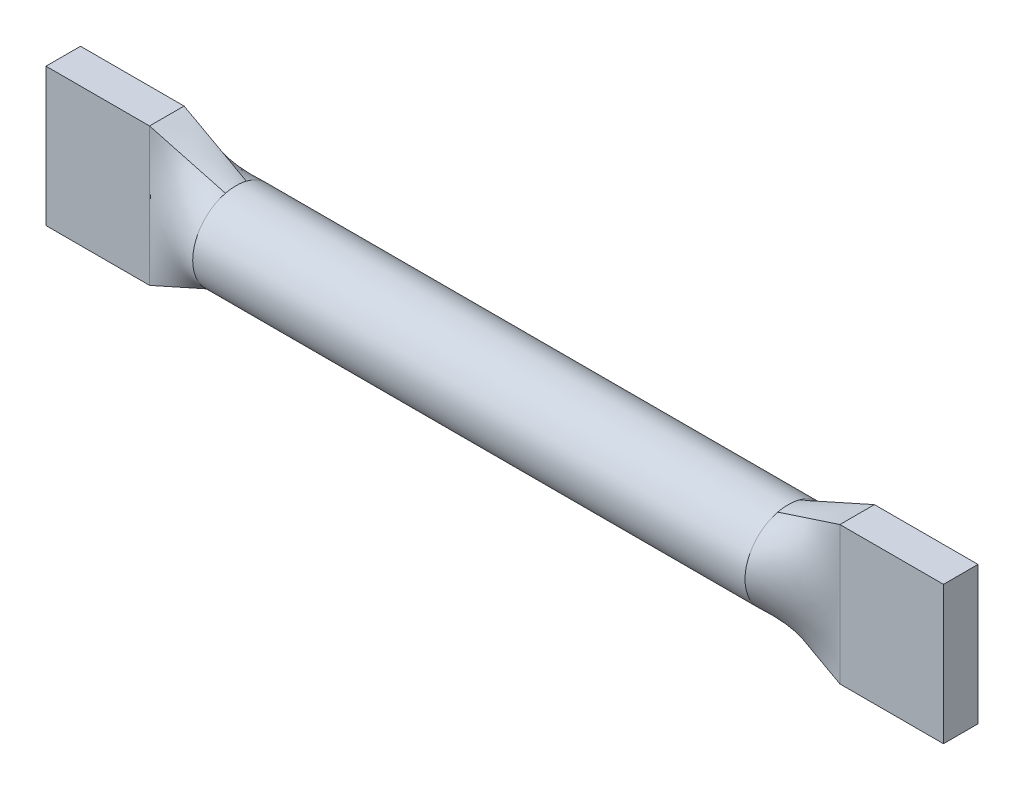
ISO-10303-21;
HEADER;
FILE_DESCRIPTION(('STEP AP214'),'2;1');
FILE_NAME('part.step','',(''),(''),'','','');
FILE_SCHEMA(('AUTOMOTIVE_DESIGN { 1 0 10303 214 1 1 1 1 }'));
ENDSEC;
DATA;
#1=APPLICATION_CONTEXT('core data for automotive mechanical design processes');
#2=APPLICATION_PROTOCOL_DEFINITION('international standard','automotive_design',2000,#1);
#3=PRODUCT_CONTEXT('',#1,'mechanical');
#4=PRODUCT('Part','Part','',(#3));
#5=PRODUCT_RELATED_PRODUCT_CATEGORY('part','',(#4));
#6=PRODUCT_DEFINITION_FORMATION('','',#4);
#7=PRODUCT_DEFINITION_CONTEXT('part definition',#1,'design');
#8=PRODUCT_DEFINITION('design','',#6,#7);
#9=PRODUCT_DEFINITION_SHAPE('','',#8);
#10=(LENGTH_UNIT() NAMED_UNIT(*) SI_UNIT(.MILLI.,.METRE.));
#11=(NAMED_UNIT(*) PLANE_ANGLE_UNIT() SI_UNIT($,.RADIAN.));
#12=(NAMED_UNIT(*) SI_UNIT($,.STERADIAN.) SOLID_ANGLE_UNIT());
#13=UNCERTAINTY_MEASURE_WITH_UNIT(LENGTH_MEASURE(1.E-05),#10,'distance_accuracy_value','');
#14=(GEOMETRIC_REPRESENTATION_CONTEXT(3) GLOBAL_UNCERTAINTY_ASSIGNED_CONTEXT((#13)) GLOBAL_UNIT_ASSIGNED_CONTEXT((#10,
#11,#12)) REPRESENTATION_CONTEXT('',''));
#15=CARTESIAN_POINT('',(0.,0.,0.));
#16=DIRECTION('',(0.,0.,1.));
#17=DIRECTION('',(1.,0.,0.));
#18=AXIS2_PLACEMENT_3D('',#15,#16,#17);
#19=CARTESIAN_POINT('',(4.,0.,0.));
#20=DIRECTION('',(-1.,0.,0.));
#21=DIRECTION('',(0.,0.,1.));
#22=AXIS2_PLACEMENT_3D('',#19,#20,#21);
#23=CYLINDRICAL_SURFACE('',#22,0.625);
#24=CARTESIAN_POINT('',(4.,0.606339039560121,-0.151584857770569));
#25=CARTESIAN_POINT('',(4.00002319869924,0.611432264371149,-0.131230323229949));
#26=CARTESIAN_POINT('',(4.00015953802985,0.615492700544378,-0.110614814075321));
#27=CARTESIAN_POINT('',(4.00045778826887,0.621521119742954,-0.069098322334352));
#28=CARTESIAN_POINT('',(4.00061967697582,0.623490908088315,-0.0481976018590627));
#29=CARTESIAN_POINT('',(4.00074736257878,0.625054477077351,-0.0123925371506096));
#30=CARTESIAN_POINT('',(4.00075644923271,0.625172099094219,0.00249072512299087));
#31=CARTESIAN_POINT('',(4.00068890808599,0.624345695991257,0.0322264147045635));
#32=CARTESIAN_POINT('',(4.00061229224982,0.62340181906183,0.0470788460267166));
#33=CARTESIAN_POINT('',(4.00041095379841,0.620425681626127,0.076990671397577));
#34=CARTESIAN_POINT('',(4.00028524940299,0.61837085688521,0.092047812070457));
#35=CARTESIAN_POINT('',(4.00008221403026,0.613170308925043,0.121976385342566));
#36=CARTESIAN_POINT('',(4.00000489433789,0.610024331477865,0.13684777382606));
#37=CARTESIAN_POINT('',(4.,0.606339018940256,0.151584940250014));
#38=B_SPLINE_CURVE_WITH_KNOTS('',3,(#24,#25,#26,#27,#28,#29,#30,#31,#32,#33,#34,#35,#36,#37),
.UNSPECIFIED.,.F.,.F.,(4,2,2,2,2,2,4),(0.,0.0629259388945802,0.125797495548134,
0.170412925881736,0.215022128457891,0.260573417572076,0.306135326829082),.UNSPECIFIED.);
#39=CARTESIAN_POINT('',(4.,0.606395418070268,-0.151598952407199));
#40=VERTEX_POINT('',#39);
#41=CARTESIAN_POINT('',(4.,0.606382766635631,0.151595877185707));
#42=VERTEX_POINT('',#41);
#43=EDGE_CURVE('E12',#40,#42,#38,.T.);
#44=ORIENTED_EDGE('',*,*,#43,.F.);
#45=CARTESIAN_POINT('',(4.,0.,0.));
#46=DIRECTION('',(1.,0.,0.));
#47=DIRECTION('',(0.,0.,-1.));
#48=AXIS2_PLACEMENT_3D('',#45,#46,#47);
#49=CIRCLE('',#48,0.625);
#50=CARTESIAN_POINT('',(4.,-0.606382766792094,-0.151595877225487));
#51=VERTEX_POINT('',#50);
#52=EDGE_CURVE('E121',#51,#40,#49,.T.);
#53=ORIENTED_EDGE('',*,*,#52,.F.);
#54=CARTESIAN_POINT('',(4.,-0.606339039560107,0.151584857770624));
#55=CARTESIAN_POINT('',(4.00002319869924,-0.611432264371138,0.131230323230004));
#56=CARTESIAN_POINT('',(4.00015953802985,-0.615492700544368,0.110614814075377));
#57=CARTESIAN_POINT('',(4.00045778826887,-0.621521119742948,0.0690983223344087));
#58=CARTESIAN_POINT('',(4.00061967697582,-0.62349090808831,0.0481976018591196));
#59=CARTESIAN_POINT('',(4.00074736257878,-0.625054477077352,0.01239253715061));
#60=CARTESIAN_POINT('',(4.00075644923271,-0.62517209909422,-0.00249072512304715));
#61=CARTESIAN_POINT('',(4.00068890808598,-0.62434569599125,-0.0322264147047328));
#62=CARTESIAN_POINT('',(4.00061229224982,-0.623401819061814,-0.0470788460269422));
#63=CARTESIAN_POINT('',(4.00041095379841,-0.620425681626086,-0.0769906713979176));
#64=CARTESIAN_POINT('',(4.00028524940299,-0.618370856885152,-0.0920478120708561));
#65=CARTESIAN_POINT('',(4.00008221403025,-0.613170308924942,-0.12197638534308));
#66=CARTESIAN_POINT('',(4.00000489433789,-0.610024331477738,-0.136847773826631));
#67=CARTESIAN_POINT('',(4.,-0.6063390189401,-0.151584940250639));
#68=B_SPLINE_CURVE_WITH_KNOTS('',3,(#54,#55,#56,#57,#58,#59,#60,#61,#62,#63,#64,#65,#66,#67),
.UNSPECIFIED.,.F.,.F.,(4,2,2,2,2,2,4),(0.,0.0629259388945799,0.125797495548134,
0.170412925881905,0.21502212845823,0.260573417572596,0.306135326829783),.UNSPECIFIED.);
#69=CARTESIAN_POINT('',(4.,-0.606395418103955,0.151598952415679));
#70=VERTEX_POINT('',#69);
#71=EDGE_CURVE('E430',#70,#51,#68,.T.);
#72=ORIENTED_EDGE('',*,*,#71,.F.);
#73=EDGE_CURVE('E510',#42,#70,#49,.T.);
#74=ORIENTED_EDGE('',*,*,#73,.F.);
#75=EDGE_LOOP('',(#44,#53,#72,#74));
#76=FACE_BOUND('',#75,.T.);
#77=CARTESIAN_POINT('',(-4.,0.606339062590832,0.151584765647708));
#78=CARTESIAN_POINT('',(-4.,0.618593964551617,0.102565157804571));
#79=CARTESIAN_POINT('',(-4.,0.624721415532009,0.0512825789022855));
#80=CARTESIAN_POINT('',(-4.,0.624721415532009,-0.0512825789022854));
#81=CARTESIAN_POINT('',(-4.,0.618593964551617,-0.102565157804571));
#82=CARTESIAN_POINT('',(-4.,0.606339062590832,-0.151584765647708));
#83=B_SPLINE_CURVE_WITH_KNOTS('',3,(#77,#78,#79,#80,#81,#82),.UNSPECIFIED.,.F.,.F.,(4,2,4),(0.,
0.5,1.),.UNSPECIFIED.);
#84=CARTESIAN_POINT('',(-4.,0.60705828899856,-0.151748952927144));
#85=VERTEX_POINT('',#84);
#86=CARTESIAN_POINT('',(-4.,0.607005347778301,0.151735841346693));
#87=VERTEX_POINT('',#86);
#88=EDGE_CURVE('E104',#85,#87,#83,.F.);
#89=ORIENTED_EDGE('',*,*,#88,.T.);
#90=CARTESIAN_POINT('',(-4.,0.,0.));
#91=DIRECTION('',(1.,0.,0.));
#92=DIRECTION('',(0.,0.,-1.));
#93=AXIS2_PLACEMENT_3D('',#90,#91,#92);
#94=CIRCLE('',#93,0.625);
#95=CARTESIAN_POINT('',(-4.,-0.607058251111747,0.151748944278222));
#96=VERTEX_POINT('',#95);
#97=EDGE_CURVE('E112',#87,#96,#94,.T.);
#98=ORIENTED_EDGE('',*,*,#97,.T.);
#99=CARTESIAN_POINT('',(-4.,-0.60700538806345,-0.151735850481081));
#100=VERTEX_POINT('',#99);
#101=EDGE_CURVE('E305',#96,#100,#94,.T.);
#102=ORIENTED_EDGE('',*,*,#101,.T.);
#103=EDGE_CURVE('E200',#100,#85,#94,.T.);
#104=ORIENTED_EDGE('',*,*,#103,.T.);
#105=EDGE_LOOP('',(#89,#98,#102,#104));
#106=FACE_BOUND('',#105,.T.);
#107=ADVANCED_FACE('F94',(#76,#106),#23,.T.);
#108=CARTESIAN_POINT('',(5.,-1.,0.25));
#109=CARTESIAN_POINT('',(4.,-0.606339062590832,0.151584765647708));
#110=CARTESIAN_POINT('',(5.,-0.833333333333333,0.25));
#111=CARTESIAN_POINT('',(4.,-0.581829258669264,0.249623981333983));
#112=CARTESIAN_POINT('',(5.,-0.666666666666667,0.25));
#113=CARTESIAN_POINT('',(4.,-0.527266641714546,0.364058002825046));
#114=CARTESIAN_POINT('',(5.,-0.416666666666667,0.25));
#115=CARTESIAN_POINT('',(4.,-0.371541972222834,0.507506057203499));
#116=CARTESIAN_POINT('',(5.,-0.333333333333333,0.25));
#117=CARTESIAN_POINT('',(4.,-0.307632412302998,0.549659321541145));
#118=CARTESIAN_POINT('',(5.,-0.166666666666666,0.25));
#119=CARTESIAN_POINT('',(4.,-0.162442635781475,0.60858480176291));
#120=CARTESIAN_POINT('',(5.,-0.083333333333333,0.25));
#121=CARTESIAN_POINT('',(4.,-0.0813308756671265,0.625));
#122=CARTESIAN_POINT('',(5.,0.0833333333333337,0.25));
#123=CARTESIAN_POINT('',(4.,0.0813308756671266,0.625));
#124=CARTESIAN_POINT('',(5.,0.166666666666667,0.25));
#125=CARTESIAN_POINT('',(4.,0.162442635781475,0.60858480176291));
#126=CARTESIAN_POINT('',(5.,0.333333333333333,0.25));
#127=CARTESIAN_POINT('',(4.,0.307632412302998,0.549659321541145));
#128=CARTESIAN_POINT('',(5.,0.416666666666667,0.25));
#129=CARTESIAN_POINT('',(4.,0.371541972222834,0.507506057203499));
#130=CARTESIAN_POINT('',(5.,0.666666666666667,0.25));
#131=CARTESIAN_POINT('',(4.,0.527266641714546,0.364058002825045));
#132=CARTESIAN_POINT('',(5.,0.833333333333333,0.25));
#133=CARTESIAN_POINT('',(4.,0.581829258669264,0.249623981333983));
#134=CARTESIAN_POINT('',(5.,1.,0.25));
#135=CARTESIAN_POINT('',(4.,0.606339062590832,0.151584765647708));
#136=B_SPLINE_SURFACE_WITH_KNOTS('',3,1,((#108,#109),(#110,#111),(#112,#113),(#114,#115),(#116,
#117),(#118,#119),(#120,#121),(#122,#123),(#124,#125),(#126,#127),(#128,#129),(#130,#131),(#132,
#133),(#134,#135)),.UNSPECIFIED.,.F.,.F.,.F.,(4,2,2,2,2,2,4),(2,2),(0.,0.25,0.375,0.5,0.625,
0.75,1.),(0.,1.),.UNSPECIFIED.);
#137=DIRECTION('',(0.,-1.,0.));
#138=VECTOR('',#137,1.);
#139=CARTESIAN_POINT('',(5.,-1.,0.25));
#140=LINE('',#139,#138);
#141=CARTESIAN_POINT('',(5.,1.,0.25));
#142=VERTEX_POINT('',#141);
#143=CARTESIAN_POINT('',(5.,-1.,0.25));
#144=VERTEX_POINT('',#143);
#145=EDGE_CURVE('E575',#142,#144,#140,.T.);
#146=DIRECTION('',(-0.926619524762666,-0.364773910739708,-0.0911934776849271));
#147=VECTOR('',#146,1.);
#148=CARTESIAN_POINT('',(4.5,0.803169531295416,0.200792382823854));
#149=LINE('',#148,#147);
#150=EDGE_CURVE('E572',#142,#42,#149,.T.);
#151=DIRECTION('',(0.926619524762666,-0.364773910739708,0.0911934776849269));
#152=VECTOR('',#151,1.);
#153=CARTESIAN_POINT('',(4.5,-0.803169531295416,0.200792382823854));
#154=LINE('',#153,#152);
#155=EDGE_CURVE('E576',#70,#144,#154,.T.);
#156=ORIENTED_EDGE('',*,*,#145,.F.);
#157=ORIENTED_EDGE('',*,*,#150,.T.);
#158=ORIENTED_EDGE('',*,*,#73,.T.);
#159=ORIENTED_EDGE('',*,*,#155,.T.);
#160=EDGE_LOOP('',(#156,#157,#158,#159));
#161=FACE_BOUND('',#160,.T.);
#162=ADVANCED_FACE('F462',(#161),#136,.T.);
#163=CARTESIAN_POINT('',(5.,1.,0.255));
#164=CARTESIAN_POINT('',(4.,0.605603768473185,0.154525942118296));
#165=CARTESIAN_POINT('',(5.,1.,0.253333333333333));
#166=CARTESIAN_POINT('',(4.,0.605848866512401,0.153545549961434));
#167=CARTESIAN_POINT('',(5.,1.,0.251666666666667));
#168=CARTESIAN_POINT('',(4.,0.606093964551617,0.152565157804571));
#169=CARTESIAN_POINT('',(5.,1.,0.25));
#170=CARTESIAN_POINT('',(4.,0.606339062590832,0.151584765647708));
#171=CARTESIAN_POINT('',(5.,1.,0.166666666666667));
#172=CARTESIAN_POINT('',(4.,0.618593964551617,0.102565157804571));
#173=CARTESIAN_POINT('',(5.,1.,0.0833333333333332));
#174=CARTESIAN_POINT('',(4.,0.624721415532009,0.0512825789022855));
#175=CARTESIAN_POINT('',(5.,1.,-0.0833333333333334));
#176=CARTESIAN_POINT('',(4.,0.624721415532009,-0.0512825789022854));
#177=CARTESIAN_POINT('',(5.,1.,-0.166666666666667));
#178=CARTESIAN_POINT('',(4.,0.618593964551617,-0.102565157804571));
#179=CARTESIAN_POINT('',(5.,1.,-0.25));
#180=CARTESIAN_POINT('',(4.,0.606339062590832,-0.151584765647708));
#181=CARTESIAN_POINT('',(5.,1.,-0.251666666666667));
#182=CARTESIAN_POINT('',(4.,0.606093964551617,-0.152565157804571));
#183=CARTESIAN_POINT('',(5.,1.,-0.253333333333333));
#184=CARTESIAN_POINT('',(4.,0.605848866512401,-0.153545549961434));
#185=CARTESIAN_POINT('',(5.,1.,-0.255));
#186=CARTESIAN_POINT('',(4.,0.605603768473185,-0.154525942118296));
#187=B_SPLINE_SURFACE_WITH_KNOTS('',3,1,((#163,#164),(#165,#166),(#167,#168),(#169,#170),(#171,
#172),(#173,#174),(#175,#176),(#177,#178),(#179,#180),(#181,#182),(#183,#184),(#185,#186)),
.UNSPECIFIED.,.F.,.F.,.F.,(4,3,2,3,4),(2,2),(-0.01,0.,0.5,1.,1.01),(0.,1.),.UNSPECIFIED.);
#188=DIRECTION('',(0.,0.,1.));
#189=VECTOR('',#188,1.);
#190=CARTESIAN_POINT('',(5.,1.,-0.25));
#191=LINE('',#190,#189);
#192=CARTESIAN_POINT('',(5.,1.,-0.25));
#193=VERTEX_POINT('',#192);
#194=EDGE_CURVE('E443',#193,#142,#191,.T.);
#195=DIRECTION('',(-0.926619524762666,-0.364773910739708,0.0911934776849271));
#196=VECTOR('',#195,1.);
#197=CARTESIAN_POINT('',(4.5,0.803169531295416,-0.200792382823854));
#198=LINE('',#197,#196);
#199=EDGE_CURVE('E574',#193,#40,#198,.T.);
#200=ORIENTED_EDGE('',*,*,#194,.F.);
#201=ORIENTED_EDGE('',*,*,#199,.T.);
#202=ORIENTED_EDGE('',*,*,#43,.T.);
#203=ORIENTED_EDGE('',*,*,#150,.F.);
#204=EDGE_LOOP('',(#200,#201,#202,#203));
#205=FACE_BOUND('',#204,.T.);
#206=ADVANCED_FACE('F408',(#205),#187,.T.);
#207=CARTESIAN_POINT('',(5.,-1.,-0.255));
#208=CARTESIAN_POINT('',(4.,-0.605603768473185,-0.154525942118296));
#209=CARTESIAN_POINT('',(5.,-1.,-0.253333333333333));
#210=CARTESIAN_POINT('',(4.,-0.605848866512401,-0.153545549961434));
#211=CARTESIAN_POINT('',(5.,-1.,-0.251666666666667));
#212=CARTESIAN_POINT('',(4.,-0.606093964551617,-0.152565157804571));
#213=CARTESIAN_POINT('',(5.,-1.,-0.25));
#214=CARTESIAN_POINT('',(4.,-0.606339062590832,-0.151584765647708));
#215=CARTESIAN_POINT('',(5.,-1.,-0.166666666666667));
#216=CARTESIAN_POINT('',(4.,-0.618593964551617,-0.102565157804571));
#217=CARTESIAN_POINT('',(5.,-1.,-0.0833333333333332));
#218=CARTESIAN_POINT('',(4.,-0.624721415532009,-0.0512825789022853));
#219=CARTESIAN_POINT('',(5.,-1.,0.0833333333333334));
#220=CARTESIAN_POINT('',(4.,-0.624721415532009,0.0512825789022856));
#221=CARTESIAN_POINT('',(5.,-1.,0.166666666666667));
#222=CARTESIAN_POINT('',(4.,-0.618593964551617,0.102565157804571));
#223=CARTESIAN_POINT('',(5.,-1.,0.25));
#224=CARTESIAN_POINT('',(4.,-0.606339062590832,0.151584765647708));
#225=CARTESIAN_POINT('',(5.,-1.,0.251666666666667));
#226=CARTESIAN_POINT('',(4.,-0.606093964551617,0.152565157804571));
#227=CARTESIAN_POINT('',(5.,-1.,0.253333333333333));
#228=CARTESIAN_POINT('',(4.,-0.605848866512401,0.153545549961434));
#229=CARTESIAN_POINT('',(5.,-1.,0.255));
#230=CARTESIAN_POINT('',(4.,-0.605603768473185,0.154525942118296));
#231=B_SPLINE_SURFACE_WITH_KNOTS('',3,1,((#207,#208),(#209,#210),(#211,#212),(#213,#214),(#215,
#216),(#217,#218),(#219,#220),(#221,#222),(#223,#224),(#225,#226),(#227,#228),(#229,#230)),
.UNSPECIFIED.,.F.,.F.,.F.,(4,3,2,3,4),(2,2),(-0.01,0.,0.5,1.,1.01),(0.,1.),.UNSPECIFIED.);
#232=DIRECTION('',(0.,0.,-1.));
#233=VECTOR('',#232,1.);
#234=CARTESIAN_POINT('',(5.,-1.,-0.25));
#235=LINE('',#234,#233);
#236=CARTESIAN_POINT('',(5.,-1.,-0.25));
#237=VERTEX_POINT('',#236);
#238=EDGE_CURVE('E388',#144,#237,#235,.T.);
#239=DIRECTION('',(-0.926619524762666,0.364773910739708,0.0911934776849271));
#240=VECTOR('',#239,1.);
#241=CARTESIAN_POINT('',(4.5,-0.803169531295416,-0.200792382823854));
#242=LINE('',#241,#240);
#243=EDGE_CURVE('E394',#237,#51,#242,.T.);
#244=ORIENTED_EDGE('',*,*,#238,.F.);
#245=ORIENTED_EDGE('',*,*,#155,.F.);
#246=ORIENTED_EDGE('',*,*,#71,.T.);
#247=ORIENTED_EDGE('',*,*,#243,.F.);
#248=EDGE_LOOP('',(#244,#245,#246,#247));
#249=FACE_BOUND('',#248,.T.);
#250=ADVANCED_FACE('F396',(#249),#231,.T.);
#251=CARTESIAN_POINT('',(5.,1.,-0.25));
#252=CARTESIAN_POINT('',(4.,0.606339062590832,-0.151584765647708));
#253=CARTESIAN_POINT('',(5.,0.833333333333333,-0.25));
#254=CARTESIAN_POINT('',(4.,0.581829258669264,-0.249623981333983));
#255=CARTESIAN_POINT('',(5.,0.666666666666666,-0.25));
#256=CARTESIAN_POINT('',(4.,0.527266641714546,-0.364058002825045));
#257=CARTESIAN_POINT('',(5.,0.416666666666666,-0.25));
#258=CARTESIAN_POINT('',(4.,0.371541972222834,-0.507506057203499));
#259=CARTESIAN_POINT('',(5.,0.333333333333333,-0.25));
#260=CARTESIAN_POINT('',(4.,0.307632412302998,-0.549659321541145));
#261=CARTESIAN_POINT('',(5.,0.166666666666666,-0.25));
#262=CARTESIAN_POINT('',(4.,0.162442635781475,-0.60858480176291));
#263=CARTESIAN_POINT('',(5.,0.0833333333333329,-0.25));
#264=CARTESIAN_POINT('',(4.,0.0813308756671265,-0.625));
#265=CARTESIAN_POINT('',(5.,-0.0833333333333338,-0.25));
#266=CARTESIAN_POINT('',(4.,-0.0813308756671266,-0.625));
#267=CARTESIAN_POINT('',(5.,-0.166666666666667,-0.25));
#268=CARTESIAN_POINT('',(4.,-0.162442635781475,-0.60858480176291));
#269=CARTESIAN_POINT('',(5.,-0.333333333333334,-0.25));
#270=CARTESIAN_POINT('',(4.,-0.307632412302998,-0.549659321541145));
#271=CARTESIAN_POINT('',(5.,-0.416666666666667,-0.25));
#272=CARTESIAN_POINT('',(4.,-0.371541972222834,-0.507506057203499));
#273=CARTESIAN_POINT('',(5.,-0.666666666666667,-0.25));
#274=CARTESIAN_POINT('',(4.,-0.527266641714546,-0.364058002825045));
#275=CARTESIAN_POINT('',(5.,-0.833333333333334,-0.25));
#276=CARTESIAN_POINT('',(4.,-0.581829258669264,-0.249623981333983));
#277=CARTESIAN_POINT('',(5.,-1.,-0.25));
#278=CARTESIAN_POINT('',(4.,-0.606339062590832,-0.151584765647708));
#279=B_SPLINE_SURFACE_WITH_KNOTS('',3,1,((#251,#252),(#253,#254),(#255,#256),(#257,#258),(#259,
#260),(#261,#262),(#263,#264),(#265,#266),(#267,#268),(#269,#270),(#271,#272),(#273,#274),(#275,
#276),(#277,#278)),.UNSPECIFIED.,.F.,.F.,.F.,(4,2,2,2,2,2,4),(2,2),(0.,0.25,0.375,0.5,0.625,
0.75,1.),(0.,1.),.UNSPECIFIED.);
#280=DIRECTION('',(0.,1.,0.));
#281=VECTOR('',#280,1.);
#282=CARTESIAN_POINT('',(5.,-1.,-0.25));
#283=LINE('',#282,#281);
#284=EDGE_CURVE('E527',#237,#193,#283,.T.);
#285=ORIENTED_EDGE('',*,*,#284,.F.);
#286=ORIENTED_EDGE('',*,*,#243,.T.);
#287=ORIENTED_EDGE('',*,*,#52,.T.);
#288=ORIENTED_EDGE('',*,*,#199,.F.);
#289=EDGE_LOOP('',(#285,#286,#287,#288));
#290=FACE_BOUND('',#289,.T.);
#291=ADVANCED_FACE('F407',(#290),#279,.T.);
#292=CARTESIAN_POINT('',(6.5,1.,-0.25));
#293=DIRECTION('',(0.,-1.,0.));
#294=DIRECTION('',(0.,0.,-1.));
#295=AXIS2_PLACEMENT_3D('',#292,#293,#294);
#296=PLANE('',#295);
#297=ORIENTED_EDGE('',*,*,#194,.T.);
#298=DIRECTION('',(-1.,0.,0.));
#299=VECTOR('',#298,1.);
#300=CARTESIAN_POINT('',(6.5,1.,0.25));
#301=LINE('',#300,#299);
#302=CARTESIAN_POINT('',(6.5,1.,0.25));
#303=VERTEX_POINT('',#302);
#304=EDGE_CURVE('E432',#303,#142,#301,.T.);
#305=ORIENTED_EDGE('',*,*,#304,.F.);
#306=DIRECTION('',(0.,0.,1.));
#307=VECTOR('',#306,1.);
#308=CARTESIAN_POINT('',(6.5,1.,-0.25));
#309=LINE('',#308,#307);
#310=CARTESIAN_POINT('',(6.5,1.,-0.25));
#311=VERTEX_POINT('',#310);
#312=EDGE_CURVE('E372',#311,#303,#309,.T.);
#313=ORIENTED_EDGE('',*,*,#312,.F.);
#314=DIRECTION('',(-1.,0.,0.));
#315=VECTOR('',#314,1.);
#316=CARTESIAN_POINT('',(6.5,1.,-0.25));
#317=LINE('',#316,#315);
#318=EDGE_CURVE('E381',#311,#193,#317,.T.);
#319=ORIENTED_EDGE('',*,*,#318,.T.);
#320=EDGE_LOOP('',(#297,#305,#313,#319));
#321=FACE_BOUND('',#320,.T.);
#322=ADVANCED_FACE('F450',(#321),#296,.F.);
#323=CARTESIAN_POINT('',(6.5,1.,0.25));
#324=DIRECTION('',(0.,0.,-1.));
#325=DIRECTION('',(-1.,0.,0.));
#326=AXIS2_PLACEMENT_3D('',#323,#324,#325);
#327=PLANE('',#326);
#328=ORIENTED_EDGE('',*,*,#145,.T.);
#329=DIRECTION('',(-1.,0.,0.));
#330=VECTOR('',#329,1.);
#331=CARTESIAN_POINT('',(6.5,-1.,0.25));
#332=LINE('',#331,#330);
#333=CARTESIAN_POINT('',(6.5,-1.,0.25));
#334=VERTEX_POINT('',#333);
#335=EDGE_CURVE('E435',#334,#144,#332,.T.);
#336=ORIENTED_EDGE('',*,*,#335,.F.);
#337=DIRECTION('',(0.,-1.,0.));
#338=VECTOR('',#337,1.);
#339=CARTESIAN_POINT('',(6.5,1.,0.25));
#340=LINE('',#339,#338);
#341=EDGE_CURVE('E375',#303,#334,#340,.T.);
#342=ORIENTED_EDGE('',*,*,#341,.F.);
#343=ORIENTED_EDGE('',*,*,#304,.T.);
#344=EDGE_LOOP('',(#328,#336,#342,#343));
#345=FACE_BOUND('',#344,.T.);
#346=ADVANCED_FACE('F459',(#345),#327,.F.);
#347=CARTESIAN_POINT('',(6.5,-1.,0.25));
#348=DIRECTION('',(0.,1.,0.));
#349=DIRECTION('',(0.,0.,1.));
#350=AXIS2_PLACEMENT_3D('',#347,#348,#349);
#351=PLANE('',#350);
#352=ORIENTED_EDGE('',*,*,#238,.T.);
#353=DIRECTION('',(-1.,0.,0.));
#354=VECTOR('',#353,1.);
#355=CARTESIAN_POINT('',(6.5,-1.,-0.25));
#356=LINE('',#355,#354);
#357=CARTESIAN_POINT('',(6.5,-1.,-0.25));
#358=VERTEX_POINT('',#357);
#359=EDGE_CURVE('E535',#358,#237,#356,.T.);
#360=ORIENTED_EDGE('',*,*,#359,.F.);
#361=DIRECTION('',(0.,0.,-1.));
#362=VECTOR('',#361,1.);
#363=CARTESIAN_POINT('',(6.5,-1.,0.25));
#364=LINE('',#363,#362);
#365=EDGE_CURVE('E377',#334,#358,#364,.T.);
#366=ORIENTED_EDGE('',*,*,#365,.F.);
#367=ORIENTED_EDGE('',*,*,#335,.T.);
#368=EDGE_LOOP('',(#352,#360,#366,#367));
#369=FACE_BOUND('',#368,.T.);
#370=ADVANCED_FACE('F548',(#369),#351,.F.);
#371=CARTESIAN_POINT('',(6.5,-1.,-0.25));
#372=DIRECTION('',(0.,0.,1.));
#373=DIRECTION('',(1.,0.,0.));
#374=AXIS2_PLACEMENT_3D('',#371,#372,#373);
#375=PLANE('',#374);
#376=ORIENTED_EDGE('',*,*,#284,.T.);
#377=ORIENTED_EDGE('',*,*,#318,.F.);
#378=DIRECTION('',(0.,1.,0.));
#379=VECTOR('',#378,1.);
#380=CARTESIAN_POINT('',(6.5,-1.,-0.25));
#381=LINE('',#380,#379);
#382=EDGE_CURVE('E379',#358,#311,#381,.T.);
#383=ORIENTED_EDGE('',*,*,#382,.F.);
#384=ORIENTED_EDGE('',*,*,#359,.T.);
#385=EDGE_LOOP('',(#376,#377,#383,#384));
#386=FACE_BOUND('',#385,.T.);
#387=ADVANCED_FACE('F556',(#386),#375,.F.);
#388=CARTESIAN_POINT('',(6.5,0.,0.));
#389=DIRECTION('',(1.,0.,0.));
#390=DIRECTION('',(0.,0.,-1.));
#391=AXIS2_PLACEMENT_3D('',#388,#389,#390);
#392=PLANE('',#391);
#393=ORIENTED_EDGE('',*,*,#312,.T.);
#394=ORIENTED_EDGE('',*,*,#341,.T.);
#395=ORIENTED_EDGE('',*,*,#365,.T.);
#396=ORIENTED_EDGE('',*,*,#382,.T.);
#397=EDGE_LOOP('',(#393,#394,#395,#396));
#398=FACE_BOUND('',#397,.T.);
#399=ADVANCED_FACE('F559',(#398),#392,.T.);
#400=CARTESIAN_POINT('',(-5.,-1.,0.25));
#401=CARTESIAN_POINT('',(-4.,-0.606339062590832,0.151584765647708));
#402=CARTESIAN_POINT('',(-5.,-0.833333333333333,0.25));
#403=CARTESIAN_POINT('',(-4.,-0.581829258669264,0.249623981333983));
#404=CARTESIAN_POINT('',(-5.,-0.666666666666667,0.25));
#405=CARTESIAN_POINT('',(-4.,-0.527266641714546,0.364058002825046));
#406=CARTESIAN_POINT('',(-5.,-0.416666666666667,0.25));
#407=CARTESIAN_POINT('',(-4.,-0.371541972222834,0.507506057203499));
#408=CARTESIAN_POINT('',(-5.,-0.333333333333333,0.25));
#409=CARTESIAN_POINT('',(-4.,-0.307632412302998,0.549659321541145));
#410=CARTESIAN_POINT('',(-5.,-0.166666666666666,0.25));
#411=CARTESIAN_POINT('',(-4.,-0.162442635781475,0.60858480176291));
#412=CARTESIAN_POINT('',(-5.,-0.083333333333333,0.25));
#413=CARTESIAN_POINT('',(-4.,-0.0813308756671265,0.625));
#414=CARTESIAN_POINT('',(-5.,0.0833333333333337,0.25));
#415=CARTESIAN_POINT('',(-4.,0.0813308756671266,0.625));
#416=CARTESIAN_POINT('',(-5.,0.166666666666667,0.25));
#417=CARTESIAN_POINT('',(-4.,0.162442635781475,0.60858480176291));
#418=CARTESIAN_POINT('',(-5.,0.333333333333333,0.25));
#419=CARTESIAN_POINT('',(-4.,0.307632412302998,0.549659321541145));
#420=CARTESIAN_POINT('',(-5.,0.416666666666667,0.25));
#421=CARTESIAN_POINT('',(-4.,0.371541972222834,0.507506057203499));
#422=CARTESIAN_POINT('',(-5.,0.666666666666667,0.25));
#423=CARTESIAN_POINT('',(-4.,0.527266641714546,0.364058002825045));
#424=CARTESIAN_POINT('',(-5.,0.833333333333333,0.25));
#425=CARTESIAN_POINT('',(-4.,0.581829258669264,0.249623981333983));
#426=CARTESIAN_POINT('',(-5.,1.,0.25));
#427=CARTESIAN_POINT('',(-4.,0.606339062590832,0.151584765647708));
#428=B_SPLINE_SURFACE_WITH_KNOTS('',3,1,((#400,#401),(#402,#403),(#404,#405),(#406,#407),(#408,
#409),(#410,#411),(#412,#413),(#414,#415),(#416,#417),(#418,#419),(#420,#421),(#422,#423),(#424,
#425),(#426,#427)),.UNSPECIFIED.,.F.,.F.,.F.,(4,2,2,2,2,2,4),(2,2),(0.,0.25,0.375,0.5,0.625,
0.75,1.),(0.,1.),.UNSPECIFIED.);
#429=DIRECTION('',(0.,-1.,0.));
#430=VECTOR('',#429,1.);
#431=CARTESIAN_POINT('',(-5.,-1.,0.25));
#432=LINE('',#431,#430);
#433=CARTESIAN_POINT('',(-5.,1.,0.25));
#434=VERTEX_POINT('',#433);
#435=CARTESIAN_POINT('',(-5.,-1.,0.25));
#436=VERTEX_POINT('',#435);
#437=EDGE_CURVE('E367',#434,#436,#432,.T.);
#438=DIRECTION('',(-0.926619524762666,-0.364773910739708,0.0911934776849269));
#439=VECTOR('',#438,1.);
#440=CARTESIAN_POINT('',(-4.5,-0.803169531295416,0.200792382823854));
#441=LINE('',#440,#439);
#442=EDGE_CURVE('E714',#96,#436,#441,.T.);
#443=DIRECTION('',(0.926619524762666,-0.364773910739708,-0.0911934776849271));
#444=VECTOR('',#443,1.);
#445=CARTESIAN_POINT('',(-4.5,0.803169531295416,0.200792382823854));
#446=LINE('',#445,#444);
#447=EDGE_CURVE('E710',#434,#87,#446,.T.);
#448=ORIENTED_EDGE('',*,*,#437,.T.);
#449=ORIENTED_EDGE('',*,*,#442,.F.);
#450=ORIENTED_EDGE('',*,*,#97,.F.);
#451=ORIENTED_EDGE('',*,*,#447,.F.);
#452=EDGE_LOOP('',(#448,#449,#450,#451));
#453=FACE_BOUND('',#452,.T.);
#454=ADVANCED_FACE('F562',(#453),#428,.F.);
#455=CARTESIAN_POINT('',(-5.,1.,0.25));
#456=CARTESIAN_POINT('',(-4.,0.606339062590832,0.151584765647708));
#457=CARTESIAN_POINT('',(-5.,1.,0.166666666666667));
#458=CARTESIAN_POINT('',(-4.,0.618593964551617,0.102565157804571));
#459=CARTESIAN_POINT('',(-5.,1.,0.0833333333333332));
#460=CARTESIAN_POINT('',(-4.,0.624721415532009,0.0512825789022855));
#461=CARTESIAN_POINT('',(-5.,1.,-0.0833333333333334));
#462=CARTESIAN_POINT('',(-4.,0.624721415532009,-0.0512825789022854));
#463=CARTESIAN_POINT('',(-5.,1.,-0.166666666666667));
#464=CARTESIAN_POINT('',(-4.,0.618593964551617,-0.102565157804571));
#465=CARTESIAN_POINT('',(-5.,1.,-0.25));
#466=CARTESIAN_POINT('',(-4.,0.606339062590832,-0.151584765647708));
#467=B_SPLINE_SURFACE_WITH_KNOTS('',3,1,((#455,#456),(#457,#458),(#459,#460),(#461,#462),(#463,
#464),(#465,#466)),.UNSPECIFIED.,.F.,.F.,.F.,(4,2,4),(2,2),(0.,0.5,1.),(0.,1.),.UNSPECIFIED.);
#468=DIRECTION('',(0.,0.,1.));
#469=VECTOR('',#468,1.);
#470=CARTESIAN_POINT('',(-5.,1.,-0.25));
#471=LINE('',#470,#469);
#472=CARTESIAN_POINT('',(-5.,1.,-0.25));
#473=VERTEX_POINT('',#472);
#474=EDGE_CURVE('E195',#473,#434,#471,.T.);
#475=DIRECTION('',(0.926619524762666,-0.364773910739708,0.0911934776849271));
#476=VECTOR('',#475,1.);
#477=CARTESIAN_POINT('',(-4.5,0.803169531295416,-0.200792382823854));
#478=LINE('',#477,#476);
#479=EDGE_CURVE('E325',#473,#85,#478,.T.);
#480=ORIENTED_EDGE('',*,*,#474,.T.);
#481=ORIENTED_EDGE('',*,*,#447,.T.);
#482=ORIENTED_EDGE('',*,*,#88,.F.);
#483=ORIENTED_EDGE('',*,*,#479,.F.);
#484=EDGE_LOOP('',(#480,#481,#482,#483));
#485=FACE_BOUND('',#484,.T.);
#486=ADVANCED_FACE('F245',(#485),#467,.F.);
#487=CARTESIAN_POINT('',(-5.,-1.,-0.25));
#488=CARTESIAN_POINT('',(-4.,-0.606339062590832,-0.151584765647708));
#489=CARTESIAN_POINT('',(-5.,-1.,-0.166666666666667));
#490=CARTESIAN_POINT('',(-4.,-0.618593964551617,-0.102565157804571));
#491=CARTESIAN_POINT('',(-5.,-1.,-0.0833333333333332));
#492=CARTESIAN_POINT('',(-4.,-0.624721415532009,-0.0512825789022853));
#493=CARTESIAN_POINT('',(-5.,-1.,0.0833333333333334));
#494=CARTESIAN_POINT('',(-4.,-0.624721415532009,0.0512825789022856));
#495=CARTESIAN_POINT('',(-5.,-1.,0.166666666666667));
#496=CARTESIAN_POINT('',(-4.,-0.618593964551617,0.102565157804571));
#497=CARTESIAN_POINT('',(-5.,-1.,0.25));
#498=CARTESIAN_POINT('',(-4.,-0.606339062590832,0.151584765647708));
#499=B_SPLINE_SURFACE_WITH_KNOTS('',3,1,((#487,#488),(#489,#490),(#491,#492),(#493,#494),(#495,
#496),(#497,#498)),.UNSPECIFIED.,.F.,.F.,.F.,(4,2,4),(2,2),(0.,0.5,1.),(0.,1.),.UNSPECIFIED.);
#500=DIRECTION('',(0.,0.,-1.));
#501=VECTOR('',#500,1.);
#502=CARTESIAN_POINT('',(-5.,-1.,-0.25));
#503=LINE('',#502,#501);
#504=CARTESIAN_POINT('',(-5.,-1.,-0.25));
#505=VERTEX_POINT('',#504);
#506=EDGE_CURVE('E225',#436,#505,#503,.T.);
#507=DIRECTION('',(0.926619524762666,0.364773910739708,0.0911934776849271));
#508=VECTOR('',#507,1.);
#509=CARTESIAN_POINT('',(-4.5,-0.803169531295416,-0.200792382823854));
#510=LINE('',#509,#508);
#511=EDGE_CURVE('E230',#505,#100,#510,.T.);
#512=ORIENTED_EDGE('',*,*,#506,.T.);
#513=ORIENTED_EDGE('',*,*,#511,.T.);
#514=ORIENTED_EDGE('',*,*,#101,.F.);
#515=ORIENTED_EDGE('',*,*,#442,.T.);
#516=EDGE_LOOP('',(#512,#513,#514,#515));
#517=FACE_BOUND('',#516,.T.);
#518=ADVANCED_FACE('F232',(#517),#499,.F.);
#519=CARTESIAN_POINT('',(-5.,1.,-0.25));
#520=CARTESIAN_POINT('',(-4.,0.606339062590832,-0.151584765647708));
#521=CARTESIAN_POINT('',(-5.,0.833333333333333,-0.25));
#522=CARTESIAN_POINT('',(-4.,0.581829258669264,-0.249623981333983));
#523=CARTESIAN_POINT('',(-5.,0.666666666666666,-0.25));
#524=CARTESIAN_POINT('',(-4.,0.527266641714546,-0.364058002825045));
#525=CARTESIAN_POINT('',(-5.,0.416666666666666,-0.25));
#526=CARTESIAN_POINT('',(-4.,0.371541972222834,-0.507506057203499));
#527=CARTESIAN_POINT('',(-5.,0.333333333333333,-0.25));
#528=CARTESIAN_POINT('',(-4.,0.307632412302998,-0.549659321541145));
#529=CARTESIAN_POINT('',(-5.,0.166666666666666,-0.25));
#530=CARTESIAN_POINT('',(-4.,0.162442635781475,-0.60858480176291));
#531=CARTESIAN_POINT('',(-5.,0.0833333333333329,-0.25));
#532=CARTESIAN_POINT('',(-4.,0.0813308756671265,-0.625));
#533=CARTESIAN_POINT('',(-5.,-0.0833333333333338,-0.25));
#534=CARTESIAN_POINT('',(-4.,-0.0813308756671266,-0.625));
#535=CARTESIAN_POINT('',(-5.,-0.166666666666667,-0.25));
#536=CARTESIAN_POINT('',(-4.,-0.162442635781475,-0.60858480176291));
#537=CARTESIAN_POINT('',(-5.,-0.333333333333334,-0.25));
#538=CARTESIAN_POINT('',(-4.,-0.307632412302998,-0.549659321541145));
#539=CARTESIAN_POINT('',(-5.,-0.416666666666667,-0.25));
#540=CARTESIAN_POINT('',(-4.,-0.371541972222834,-0.507506057203499));
#541=CARTESIAN_POINT('',(-5.,-0.666666666666667,-0.25));
#542=CARTESIAN_POINT('',(-4.,-0.527266641714546,-0.364058002825045));
#543=CARTESIAN_POINT('',(-5.,-0.833333333333334,-0.25));
#544=CARTESIAN_POINT('',(-4.,-0.581829258669264,-0.249623981333983));
#545=CARTESIAN_POINT('',(-5.,-1.,-0.25));
#546=CARTESIAN_POINT('',(-4.,-0.606339062590832,-0.151584765647708));
#547=B_SPLINE_SURFACE_WITH_KNOTS('',3,1,((#519,#520),(#521,#522),(#523,#524),(#525,#526),(#527,
#528),(#529,#530),(#531,#532),(#533,#534),(#535,#536),(#537,#538),(#539,#540),(#541,#542),(#543,
#544),(#545,#546)),.UNSPECIFIED.,.F.,.F.,.F.,(4,2,2,2,2,2,4),(2,2),(0.,0.25,0.375,0.5,0.625,
0.75,1.),(0.,1.),.UNSPECIFIED.);
#548=DIRECTION('',(0.,1.,0.));
#549=VECTOR('',#548,1.);
#550=CARTESIAN_POINT('',(-5.,-1.,-0.25));
#551=LINE('',#550,#549);
#552=EDGE_CURVE('E98',#505,#473,#551,.T.);
#553=ORIENTED_EDGE('',*,*,#552,.T.);
#554=ORIENTED_EDGE('',*,*,#479,.T.);
#555=ORIENTED_EDGE('',*,*,#103,.F.);
#556=ORIENTED_EDGE('',*,*,#511,.F.);
#557=EDGE_LOOP('',(#553,#554,#555,#556));
#558=FACE_BOUND('',#557,.T.);
#559=ADVANCED_FACE('F244',(#558),#547,.F.);
#560=CARTESIAN_POINT('',(-6.5,1.,-0.25));
#561=DIRECTION('',(0.,1.,0.));
#562=DIRECTION('',(0.,0.,1.));
#563=AXIS2_PLACEMENT_3D('',#560,#561,#562);
#564=PLANE('',#563);
#565=ORIENTED_EDGE('',*,*,#474,.F.);
#566=DIRECTION('',(1.,0.,0.));
#567=VECTOR('',#566,1.);
#568=CARTESIAN_POINT('',(-6.5,1.,-0.25));
#569=LINE('',#568,#567);
#570=CARTESIAN_POINT('',(-6.5,1.,-0.25));
#571=VERTEX_POINT('',#570);
#572=EDGE_CURVE('E189',#571,#473,#569,.T.);
#573=ORIENTED_EDGE('',*,*,#572,.F.);
#574=DIRECTION('',(0.,0.,1.));
#575=VECTOR('',#574,1.);
#576=CARTESIAN_POINT('',(-6.5,1.,-0.25));
#577=LINE('',#576,#575);
#578=CARTESIAN_POINT('',(-6.5,1.,0.25));
#579=VERTEX_POINT('',#578);
#580=EDGE_CURVE('E192',#571,#579,#577,.T.);
#581=ORIENTED_EDGE('',*,*,#580,.T.);
#582=DIRECTION('',(1.,0.,0.));
#583=VECTOR('',#582,1.);
#584=CARTESIAN_POINT('',(-6.5,1.,0.25));
#585=LINE('',#584,#583);
#586=EDGE_CURVE('E219',#579,#434,#585,.T.);
#587=ORIENTED_EDGE('',*,*,#586,.T.);
#588=EDGE_LOOP('',(#565,#573,#581,#587));
#589=FACE_BOUND('',#588,.T.);
#590=ADVANCED_FACE('F191',(#589),#564,.T.);
#591=CARTESIAN_POINT('',(-6.5,-1.,-0.25));
#592=DIRECTION('',(0.,0.,-1.));
#593=DIRECTION('',(-1.,0.,0.));
#594=AXIS2_PLACEMENT_3D('',#591,#592,#593);
#595=PLANE('',#594);
#596=ORIENTED_EDGE('',*,*,#552,.F.);
#597=DIRECTION('',(1.,0.,0.));
#598=VECTOR('',#597,1.);
#599=CARTESIAN_POINT('',(-6.5,-1.,-0.25));
#600=LINE('',#599,#598);
#601=CARTESIAN_POINT('',(-6.5,-1.,-0.25));
#602=VERTEX_POINT('',#601);
#603=EDGE_CURVE('E201',#602,#505,#600,.T.);
#604=ORIENTED_EDGE('',*,*,#603,.F.);
#605=DIRECTION('',(0.,1.,0.));
#606=VECTOR('',#605,1.);
#607=CARTESIAN_POINT('',(-6.5,-1.,-0.25));
#608=LINE('',#607,#606);
#609=EDGE_CURVE('E207',#602,#571,#608,.T.);
#610=ORIENTED_EDGE('',*,*,#609,.T.);
#611=ORIENTED_EDGE('',*,*,#572,.T.);
#612=EDGE_LOOP('',(#596,#604,#610,#611));
#613=FACE_BOUND('',#612,.T.);
#614=ADVANCED_FACE('F212',(#613),#595,.T.);
#615=CARTESIAN_POINT('',(-6.5,-1.,0.25));
#616=DIRECTION('',(0.,-1.,0.));
#617=DIRECTION('',(0.,0.,-1.));
#618=AXIS2_PLACEMENT_3D('',#615,#616,#617);
#619=PLANE('',#618);
#620=ORIENTED_EDGE('',*,*,#506,.F.);
#621=DIRECTION('',(1.,0.,0.));
#622=VECTOR('',#621,1.);
#623=CARTESIAN_POINT('',(-6.5,-1.,0.25));
#624=LINE('',#623,#622);
#625=CARTESIAN_POINT('',(-6.5,-1.,0.25));
#626=VERTEX_POINT('',#625);
#627=EDGE_CURVE('E328',#626,#436,#624,.T.);
#628=ORIENTED_EDGE('',*,*,#627,.F.);
#629=DIRECTION('',(0.,0.,-1.));
#630=VECTOR('',#629,1.);
#631=CARTESIAN_POINT('',(-6.5,-1.,0.25));
#632=LINE('',#631,#630);
#633=EDGE_CURVE('E214',#626,#602,#632,.T.);
#634=ORIENTED_EDGE('',*,*,#633,.T.);
#635=ORIENTED_EDGE('',*,*,#603,.T.);
#636=EDGE_LOOP('',(#620,#628,#634,#635));
#637=FACE_BOUND('',#636,.T.);
#638=ADVANCED_FACE('F338',(#637),#619,.T.);
#639=CARTESIAN_POINT('',(-6.5,1.,0.25));
#640=DIRECTION('',(0.,0.,1.));
#641=DIRECTION('',(1.,0.,0.));
#642=AXIS2_PLACEMENT_3D('',#639,#640,#641);
#643=PLANE('',#642);
#644=ORIENTED_EDGE('',*,*,#437,.F.);
#645=ORIENTED_EDGE('',*,*,#586,.F.);
#646=DIRECTION('',(0.,-1.,0.));
#647=VECTOR('',#646,1.);
#648=CARTESIAN_POINT('',(-6.5,1.,0.25));
#649=LINE('',#648,#647);
#650=EDGE_CURVE('E210',#579,#626,#649,.T.);
#651=ORIENTED_EDGE('',*,*,#650,.T.);
#652=ORIENTED_EDGE('',*,*,#627,.T.);
#653=EDGE_LOOP('',(#644,#645,#651,#652));
#654=FACE_BOUND('',#653,.T.);
#655=ADVANCED_FACE('F348',(#654),#643,.T.);
#656=CARTESIAN_POINT('',(-6.5,0.,0.));
#657=DIRECTION('',(-1.,0.,0.));
#658=DIRECTION('',(0.,0.,-1.));
#659=AXIS2_PLACEMENT_3D('',#656,#657,#658);
#660=PLANE('',#659);
#661=ORIENTED_EDGE('',*,*,#580,.F.);
#662=ORIENTED_EDGE('',*,*,#609,.F.);
#663=ORIENTED_EDGE('',*,*,#633,.F.);
#664=ORIENTED_EDGE('',*,*,#650,.F.);
#665=EDGE_LOOP('',(#661,#662,#663,#664));
#666=FACE_BOUND('',#665,.T.);
#667=ADVANCED_FACE('F205',(#666),#660,.T.);
#668=CLOSED_SHELL('',(#107,#162,#206,#250,#291,#322,#346,#370,#387,#399,#454,#486,#518,#559,
#590,#614,#638,#655,#667));
#669=MANIFOLD_SOLID_BREP('B2',#668);
#670=ADVANCED_BREP_SHAPE_REPRESENTATION('',(#18,#669),#14);
#671=SHAPE_DEFINITION_REPRESENTATION(#9,#670);
ENDSEC;
END-ISO-10303-21;
